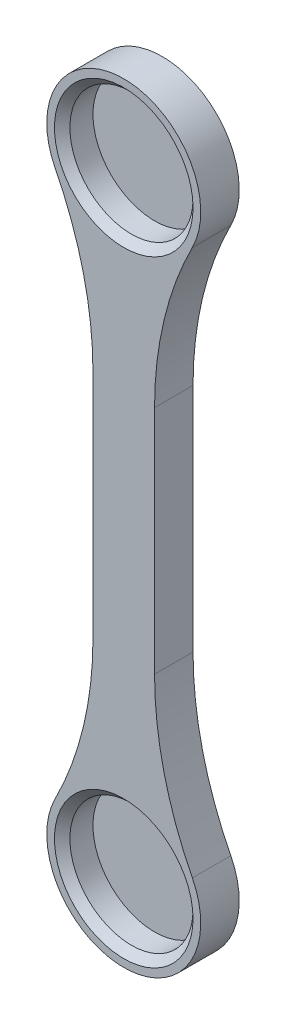
ISO-10303-21;
HEADER;
FILE_DESCRIPTION(('STEP AP214'),'2;1');
FILE_NAME('part.step','',(''),(''),'','','');
FILE_SCHEMA(('AUTOMOTIVE_DESIGN { 1 0 10303 214 1 1 1 1 }'));
ENDSEC;
DATA;
#1=APPLICATION_CONTEXT('core data for automotive mechanical design processes');
#2=APPLICATION_PROTOCOL_DEFINITION('international standard','automotive_design',2000,#1);
#3=PRODUCT_CONTEXT('',#1,'mechanical');
#4=PRODUCT('Part','Part','',(#3));
#5=PRODUCT_RELATED_PRODUCT_CATEGORY('part','',(#4));
#6=PRODUCT_DEFINITION_FORMATION('','',#4);
#7=PRODUCT_DEFINITION_CONTEXT('part definition',#1,'design');
#8=PRODUCT_DEFINITION('design','',#6,#7);
#9=PRODUCT_DEFINITION_SHAPE('','',#8);
#10=(LENGTH_UNIT() NAMED_UNIT(*) SI_UNIT(.MILLI.,.METRE.));
#11=(NAMED_UNIT(*) PLANE_ANGLE_UNIT() SI_UNIT($,.RADIAN.));
#12=(NAMED_UNIT(*) SI_UNIT($,.STERADIAN.) SOLID_ANGLE_UNIT());
#13=UNCERTAINTY_MEASURE_WITH_UNIT(LENGTH_MEASURE(1.E-05),#10,'distance_accuracy_value','');
#14=(GEOMETRIC_REPRESENTATION_CONTEXT(3) GLOBAL_UNCERTAINTY_ASSIGNED_CONTEXT((#13)) GLOBAL_UNIT_ASSIGNED_CONTEXT((#10,
#11,#12)) REPRESENTATION_CONTEXT('',''));
#15=CARTESIAN_POINT('',(0.,0.,0.));
#16=DIRECTION('',(0.,0.,1.));
#17=DIRECTION('',(1.,0.,0.));
#18=AXIS2_PLACEMENT_3D('',#15,#16,#17);
#19=CARTESIAN_POINT('',(0.,0.,5.));
#20=DIRECTION('',(0.,0.,-1.));
#21=DIRECTION('',(-1.,0.,0.));
#22=AXIS2_PLACEMENT_3D('',#19,#20,#21);
#23=CYLINDRICAL_SURFACE('',#22,10.);
#24=CARTESIAN_POINT('',(0.,0.,0.));
#25=DIRECTION('',(0.,0.,1.));
#26=DIRECTION('',(1.,0.,0.));
#27=AXIS2_PLACEMENT_3D('',#24,#25,#26);
#28=CIRCLE('',#27,10.);
#29=CARTESIAN_POINT('',(-8.91074130105901,4.53857791225414,0.));
#30=VERTEX_POINT('',#29);
#31=CARTESIAN_POINT('',(8.91074130105901,4.53857791225414,0.));
#32=VERTEX_POINT('',#31);
#33=EDGE_CURVE('E137',#30,#32,#28,.T.);
#34=ORIENTED_EDGE('',*,*,#33,.T.);
#35=DIRECTION('',(0.,0.,1.));
#36=VECTOR('',#35,1.);
#37=CARTESIAN_POINT('',(8.91074130105901,4.53857791225414,0.));
#38=LINE('',#37,#36);
#39=CARTESIAN_POINT('',(8.91074130105901,4.53857791225414,5.));
#40=VERTEX_POINT('',#39);
#41=EDGE_CURVE('E246',#32,#40,#38,.T.);
#42=ORIENTED_EDGE('',*,*,#41,.T.);
#43=CARTESIAN_POINT('',(0.,0.,5.));
#44=DIRECTION('',(0.,0.,1.));
#45=DIRECTION('',(1.,0.,0.));
#46=AXIS2_PLACEMENT_3D('',#43,#44,#45);
#47=CIRCLE('',#46,10.);
#48=CARTESIAN_POINT('',(-8.91074130105901,4.53857791225414,5.));
#49=VERTEX_POINT('',#48);
#50=EDGE_CURVE('E141',#49,#40,#47,.T.);
#51=ORIENTED_EDGE('',*,*,#50,.F.);
#52=DIRECTION('',(0.,0.,1.));
#53=VECTOR('',#52,1.);
#54=CARTESIAN_POINT('',(-8.91074130105901,4.53857791225414,0.));
#55=LINE('',#54,#53);
#56=EDGE_CURVE('E238',#30,#49,#55,.T.);
#57=ORIENTED_EDGE('',*,*,#56,.F.);
#58=EDGE_LOOP('',(#34,#42,#51,#57));
#59=FACE_BOUND('',#58,.T.);
#60=ADVANCED_FACE('F39',(#59),#23,.T.);
#61=CARTESIAN_POINT('',(0.,80.,5.));
#62=DIRECTION('',(0.,0.,-1.));
#63=DIRECTION('',(-1.,0.,0.));
#64=AXIS2_PLACEMENT_3D('',#61,#62,#63);
#65=CYLINDRICAL_SURFACE('',#64,10.);
#66=CARTESIAN_POINT('',(0.,80.,0.));
#67=DIRECTION('',(0.,0.,1.));
#68=DIRECTION('',(1.,0.,0.));
#69=AXIS2_PLACEMENT_3D('',#66,#67,#68);
#70=CIRCLE('',#69,10.);
#71=CARTESIAN_POINT('',(8.910741301059,75.4614220877458,0.));
#72=VERTEX_POINT('',#71);
#73=CARTESIAN_POINT('',(-8.910741301059,75.4614220877458,0.));
#74=VERTEX_POINT('',#73);
#75=EDGE_CURVE('E55',#72,#74,#70,.T.);
#76=ORIENTED_EDGE('',*,*,#75,.T.);
#77=DIRECTION('',(0.,0.,1.));
#78=VECTOR('',#77,1.);
#79=CARTESIAN_POINT('',(-8.910741301059,75.4614220877458,0.));
#80=LINE('',#79,#78);
#81=CARTESIAN_POINT('',(-8.910741301059,75.4614220877458,5.));
#82=VERTEX_POINT('',#81);
#83=EDGE_CURVE('E240',#74,#82,#80,.T.);
#84=ORIENTED_EDGE('',*,*,#83,.T.);
#85=CARTESIAN_POINT('',(0.,80.,5.));
#86=DIRECTION('',(0.,0.,1.));
#87=DIRECTION('',(1.,0.,0.));
#88=AXIS2_PLACEMENT_3D('',#85,#86,#87);
#89=CIRCLE('',#88,10.);
#90=CARTESIAN_POINT('',(8.910741301059,75.4614220877458,5.));
#91=VERTEX_POINT('',#90);
#92=EDGE_CURVE('E143',#91,#82,#89,.T.);
#93=ORIENTED_EDGE('',*,*,#92,.F.);
#94=DIRECTION('',(0.,0.,1.));
#95=VECTOR('',#94,1.);
#96=CARTESIAN_POINT('',(8.910741301059,75.4614220877458,0.));
#97=LINE('',#96,#95);
#98=EDGE_CURVE('E115',#72,#91,#97,.T.);
#99=ORIENTED_EDGE('',*,*,#98,.F.);
#100=EDGE_LOOP('',(#76,#84,#93,#99));
#101=FACE_BOUND('',#100,.T.);
#102=ADVANCED_FACE('F181',(#101),#65,.T.);
#103=CARTESIAN_POINT('',(0.,0.,5.));
#104=DIRECTION('',(0.,0.,1.));
#105=DIRECTION('',(1.,0.,0.));
#106=AXIS2_PLACEMENT_3D('',#103,#104,#105);
#107=PLANE('',#106);
#108=CARTESIAN_POINT('',(0.,0.,5.));
#109=DIRECTION('',(0.,0.,1.));
#110=DIRECTION('',(1.,0.,0.));
#111=AXIS2_PLACEMENT_3D('',#108,#109,#110);
#112=CIRCLE('',#111,9.00000000000002);
#113=CARTESIAN_POINT('',(9.00000000000002,0.,5.));
#114=VERTEX_POINT('',#113);
#115=EDGE_CURVE('E48',#114,#114,#112,.F.);
#116=ORIENTED_EDGE('',*,*,#115,.T.);
#117=EDGE_LOOP('',(#116));
#118=FACE_BOUND('',#117,.T.);
#119=CARTESIAN_POINT('',(0.,80.,5.));
#120=DIRECTION('',(0.,0.,1.));
#121=DIRECTION('',(1.,0.,0.));
#122=AXIS2_PLACEMENT_3D('',#119,#120,#121);
#123=CIRCLE('',#122,9.00000000000002);
#124=CARTESIAN_POINT('',(9.00000000000002,80.,5.));
#125=VERTEX_POINT('',#124);
#126=EDGE_CURVE('E150',#125,#125,#123,.F.);
#127=ORIENTED_EDGE('',*,*,#126,.T.);
#128=EDGE_LOOP('',(#127));
#129=FACE_BOUND('',#128,.T.);
#130=CARTESIAN_POINT('',(-49.0833333333333,25.,5.));
#131=DIRECTION('',(0.,0.,1.));
#132=DIRECTION('',(1.,0.,0.));
#133=AXIS2_PLACEMENT_3D('',#130,#131,#132);
#134=CIRCLE('',#133,45.0833333333333);
#135=CARTESIAN_POINT('',(-4.,25.,5.));
#136=VERTEX_POINT('',#135);
#137=EDGE_CURVE('E220',#49,#136,#134,.T.);
#138=ORIENTED_EDGE('',*,*,#137,.F.);
#139=ORIENTED_EDGE('',*,*,#50,.T.);
#140=CARTESIAN_POINT('',(49.0833333333333,25.,5.));
#141=DIRECTION('',(0.,0.,1.));
#142=DIRECTION('',(-1.,0.,0.));
#143=AXIS2_PLACEMENT_3D('',#140,#141,#142);
#144=CIRCLE('',#143,45.0833333333333);
#145=CARTESIAN_POINT('',(4.,25.,5.));
#146=VERTEX_POINT('',#145);
#147=EDGE_CURVE('E127',#146,#40,#144,.T.);
#148=ORIENTED_EDGE('',*,*,#147,.F.);
#149=DIRECTION('',(0.,-1.,0.));
#150=VECTOR('',#149,1.);
#151=CARTESIAN_POINT('',(4.,55.,5.));
#152=LINE('',#151,#150);
#153=CARTESIAN_POINT('',(4.,55.,5.));
#154=VERTEX_POINT('',#153);
#155=EDGE_CURVE('E130',#154,#146,#152,.T.);
#156=ORIENTED_EDGE('',*,*,#155,.F.);
#157=CARTESIAN_POINT('',(49.0833333333333,55.,5.));
#158=DIRECTION('',(0.,0.,1.));
#159=DIRECTION('',(1.,0.,0.));
#160=AXIS2_PLACEMENT_3D('',#157,#158,#159);
#161=CIRCLE('',#160,45.0833333333333);
#162=EDGE_CURVE('E111',#91,#154,#161,.T.);
#163=ORIENTED_EDGE('',*,*,#162,.F.);
#164=ORIENTED_EDGE('',*,*,#92,.T.);
#165=CARTESIAN_POINT('',(-49.0833333333333,55.,5.));
#166=DIRECTION('',(0.,0.,1.));
#167=DIRECTION('',(-1.,0.,0.));
#168=AXIS2_PLACEMENT_3D('',#165,#166,#167);
#169=CIRCLE('',#168,45.0833333333333);
#170=CARTESIAN_POINT('',(-4.,55.,5.));
#171=VERTEX_POINT('',#170);
#172=EDGE_CURVE('E227',#171,#82,#169,.T.);
#173=ORIENTED_EDGE('',*,*,#172,.F.);
#174=DIRECTION('',(0.,1.,0.));
#175=VECTOR('',#174,1.);
#176=CARTESIAN_POINT('',(-4.,55.,5.));
#177=LINE('',#176,#175);
#178=EDGE_CURVE('E224',#136,#171,#177,.T.);
#179=ORIENTED_EDGE('',*,*,#178,.F.);
#180=EDGE_LOOP('',(#138,#139,#148,#156,#163,#164,#173,#179));
#181=FACE_BOUND('',#180,.T.);
#182=ADVANCED_FACE('F155',(#118,#129,#181),#107,.T.);
#183=CARTESIAN_POINT('',(0.,0.,0.));
#184=DIRECTION('',(0.,0.,1.));
#185=DIRECTION('',(1.,0.,0.));
#186=AXIS2_PLACEMENT_3D('',#183,#184,#185);
#187=PLANE('',#186);
#188=ORIENTED_EDGE('',*,*,#33,.F.);
#189=CARTESIAN_POINT('',(-49.0833333333333,25.,0.));
#190=DIRECTION('',(0.,0.,1.));
#191=DIRECTION('',(1.,0.,0.));
#192=AXIS2_PLACEMENT_3D('',#189,#190,#191);
#193=CIRCLE('',#192,45.0833333333333);
#194=CARTESIAN_POINT('',(-4.,25.,0.));
#195=VERTEX_POINT('',#194);
#196=EDGE_CURVE('E253',#30,#195,#193,.T.);
#197=ORIENTED_EDGE('',*,*,#196,.T.);
#198=DIRECTION('',(0.,1.,0.));
#199=VECTOR('',#198,1.);
#200=CARTESIAN_POINT('',(-4.,55.,0.));
#201=LINE('',#200,#199);
#202=CARTESIAN_POINT('',(-4.,55.,0.));
#203=VERTEX_POINT('',#202);
#204=EDGE_CURVE('E243',#195,#203,#201,.T.);
#205=ORIENTED_EDGE('',*,*,#204,.T.);
#206=CARTESIAN_POINT('',(-49.0833333333333,55.,0.));
#207=DIRECTION('',(0.,0.,1.));
#208=DIRECTION('',(-1.,0.,0.));
#209=AXIS2_PLACEMENT_3D('',#206,#207,#208);
#210=CIRCLE('',#209,45.0833333333333);
#211=EDGE_CURVE('E229',#203,#74,#210,.T.);
#212=ORIENTED_EDGE('',*,*,#211,.T.);
#213=ORIENTED_EDGE('',*,*,#75,.F.);
#214=CARTESIAN_POINT('',(49.0833333333333,55.,0.));
#215=DIRECTION('',(0.,0.,1.));
#216=DIRECTION('',(1.,0.,0.));
#217=AXIS2_PLACEMENT_3D('',#214,#215,#216);
#218=CIRCLE('',#217,45.0833333333333);
#219=CARTESIAN_POINT('',(4.,55.,0.));
#220=VERTEX_POINT('',#219);
#221=EDGE_CURVE('E108',#72,#220,#218,.T.);
#222=ORIENTED_EDGE('',*,*,#221,.T.);
#223=DIRECTION('',(0.,-1.,0.));
#224=VECTOR('',#223,1.);
#225=CARTESIAN_POINT('',(4.,55.,0.));
#226=LINE('',#225,#224);
#227=CARTESIAN_POINT('',(4.,25.,0.));
#228=VERTEX_POINT('',#227);
#229=EDGE_CURVE('E119',#220,#228,#226,.T.);
#230=ORIENTED_EDGE('',*,*,#229,.T.);
#231=CARTESIAN_POINT('',(49.0833333333333,25.,0.));
#232=DIRECTION('',(0.,0.,1.));
#233=DIRECTION('',(-1.,0.,0.));
#234=AXIS2_PLACEMENT_3D('',#231,#232,#233);
#235=CIRCLE('',#234,45.0833333333333);
#236=EDGE_CURVE('E123',#228,#32,#235,.T.);
#237=ORIENTED_EDGE('',*,*,#236,.T.);
#238=EDGE_LOOP('',(#188,#197,#205,#212,#213,#222,#230,#237));
#239=FACE_BOUND('',#238,.T.);
#240=ADVANCED_FACE('F126',(#239),#187,.F.);
#241=CARTESIAN_POINT('',(0.,80.,1.));
#242=DIRECTION('',(0.,0.,1.));
#243=DIRECTION('',(1.,0.,0.));
#244=AXIS2_PLACEMENT_3D('',#241,#242,#243);
#245=CYLINDRICAL_SURFACE('',#244,8.);
#246=CARTESIAN_POINT('',(0.,80.,3.99999999999998));
#247=DIRECTION('',(0.,0.,1.));
#248=DIRECTION('',(1.,0.,0.));
#249=AXIS2_PLACEMENT_3D('',#246,#247,#248);
#250=CIRCLE('',#249,8.);
#251=CARTESIAN_POINT('',(8.,80.,3.99999999999998));
#252=VERTEX_POINT('',#251);
#253=EDGE_CURVE('E11',#252,#252,#250,.T.);
#254=ORIENTED_EDGE('',*,*,#253,.T.);
#255=EDGE_LOOP('',(#254));
#256=FACE_BOUND('',#255,.T.);
#257=CARTESIAN_POINT('',(0.,80.,1.));
#258=DIRECTION('',(0.,0.,1.));
#259=DIRECTION('',(1.,0.,0.));
#260=AXIS2_PLACEMENT_3D('',#257,#258,#259);
#261=CIRCLE('',#260,8.);
#262=CARTESIAN_POINT('',(8.,80.,1.));
#263=VERTEX_POINT('',#262);
#264=EDGE_CURVE('E138',#263,#263,#261,.T.);
#265=ORIENTED_EDGE('',*,*,#264,.F.);
#266=EDGE_LOOP('',(#265));
#267=FACE_BOUND('',#266,.T.);
#268=ADVANCED_FACE('F197',(#256,#267),#245,.F.);
#269=CARTESIAN_POINT('',(0.,80.,1.));
#270=DIRECTION('',(0.,0.,1.));
#271=DIRECTION('',(1.,0.,0.));
#272=AXIS2_PLACEMENT_3D('',#269,#270,#271);
#273=PLANE('',#272);
#274=ORIENTED_EDGE('',*,*,#264,.T.);
#275=EDGE_LOOP('',(#274));
#276=FACE_BOUND('',#275,.T.);
#277=ADVANCED_FACE('F168',(#276),#273,.T.);
#278=CARTESIAN_POINT('',(0.,0.,1.));
#279=DIRECTION('',(0.,0.,1.));
#280=DIRECTION('',(1.,0.,0.));
#281=AXIS2_PLACEMENT_3D('',#278,#279,#280);
#282=CYLINDRICAL_SURFACE('',#281,8.);
#283=CARTESIAN_POINT('',(0.,0.,3.99999999999998));
#284=DIRECTION('',(0.,0.,1.));
#285=DIRECTION('',(1.,0.,0.));
#286=AXIS2_PLACEMENT_3D('',#283,#284,#285);
#287=CIRCLE('',#286,8.);
#288=CARTESIAN_POINT('',(8.,0.,3.99999999999998));
#289=VERTEX_POINT('',#288);
#290=EDGE_CURVE('E145',#289,#289,#287,.T.);
#291=ORIENTED_EDGE('',*,*,#290,.T.);
#292=EDGE_LOOP('',(#291));
#293=FACE_BOUND('',#292,.T.);
#294=CARTESIAN_POINT('',(0.,0.,1.));
#295=DIRECTION('',(0.,0.,1.));
#296=DIRECTION('',(1.,0.,0.));
#297=AXIS2_PLACEMENT_3D('',#294,#295,#296);
#298=CIRCLE('',#297,8.);
#299=CARTESIAN_POINT('',(8.,0.,1.));
#300=VERTEX_POINT('',#299);
#301=EDGE_CURVE('E134',#300,#300,#298,.T.);
#302=ORIENTED_EDGE('',*,*,#301,.F.);
#303=EDGE_LOOP('',(#302));
#304=FACE_BOUND('',#303,.T.);
#305=ADVANCED_FACE('F164',(#293,#304),#282,.F.);
#306=CARTESIAN_POINT('',(0.,0.,1.));
#307=DIRECTION('',(0.,0.,1.));
#308=DIRECTION('',(1.,0.,0.));
#309=AXIS2_PLACEMENT_3D('',#306,#307,#308);
#310=PLANE('',#309);
#311=ORIENTED_EDGE('',*,*,#301,.T.);
#312=EDGE_LOOP('',(#311));
#313=FACE_BOUND('',#312,.T.);
#314=ADVANCED_FACE('F167',(#313),#310,.T.);
#315=CARTESIAN_POINT('',(49.0833333333333,25.,0.));
#316=DIRECTION('',(0.,0.,1.));
#317=DIRECTION('',(1.,0.,0.));
#318=AXIS2_PLACEMENT_3D('',#315,#316,#317);
#319=CYLINDRICAL_SURFACE('',#318,45.0833333333333);
#320=ORIENTED_EDGE('',*,*,#147,.T.);
#321=ORIENTED_EDGE('',*,*,#41,.F.);
#322=ORIENTED_EDGE('',*,*,#236,.F.);
#323=DIRECTION('',(0.,0.,1.));
#324=VECTOR('',#323,1.);
#325=CARTESIAN_POINT('',(4.,25.,0.));
#326=LINE('',#325,#324);
#327=EDGE_CURVE('E116',#228,#146,#326,.T.);
#328=ORIENTED_EDGE('',*,*,#327,.T.);
#329=EDGE_LOOP('',(#320,#321,#322,#328));
#330=FACE_BOUND('',#329,.T.);
#331=ADVANCED_FACE('F173',(#330),#319,.F.);
#332=CARTESIAN_POINT('',(4.,55.,0.));
#333=DIRECTION('',(-1.,0.,0.));
#334=DIRECTION('',(0.,0.,1.));
#335=AXIS2_PLACEMENT_3D('',#332,#333,#334);
#336=PLANE('',#335);
#337=ORIENTED_EDGE('',*,*,#155,.T.);
#338=ORIENTED_EDGE('',*,*,#327,.F.);
#339=ORIENTED_EDGE('',*,*,#229,.F.);
#340=DIRECTION('',(0.,0.,1.));
#341=VECTOR('',#340,1.);
#342=CARTESIAN_POINT('',(4.,55.,0.));
#343=LINE('',#342,#341);
#344=EDGE_CURVE('E104',#220,#154,#343,.T.);
#345=ORIENTED_EDGE('',*,*,#344,.T.);
#346=EDGE_LOOP('',(#337,#338,#339,#345));
#347=FACE_BOUND('',#346,.T.);
#348=ADVANCED_FACE('F120',(#347),#336,.F.);
#349=CARTESIAN_POINT('',(49.0833333333333,55.,0.));
#350=DIRECTION('',(0.,0.,1.));
#351=DIRECTION('',(1.,0.,0.));
#352=AXIS2_PLACEMENT_3D('',#349,#350,#351);
#353=CYLINDRICAL_SURFACE('',#352,45.0833333333333);
#354=ORIENTED_EDGE('',*,*,#162,.T.);
#355=ORIENTED_EDGE('',*,*,#344,.F.);
#356=ORIENTED_EDGE('',*,*,#221,.F.);
#357=ORIENTED_EDGE('',*,*,#98,.T.);
#358=EDGE_LOOP('',(#354,#355,#356,#357));
#359=FACE_BOUND('',#358,.T.);
#360=ADVANCED_FACE('F106',(#359),#353,.F.);
#361=CARTESIAN_POINT('',(-49.0833333333333,55.,0.));
#362=DIRECTION('',(0.,0.,1.));
#363=DIRECTION('',(1.,0.,0.));
#364=AXIS2_PLACEMENT_3D('',#361,#362,#363);
#365=CYLINDRICAL_SURFACE('',#364,45.0833333333333);
#366=ORIENTED_EDGE('',*,*,#172,.T.);
#367=ORIENTED_EDGE('',*,*,#83,.F.);
#368=ORIENTED_EDGE('',*,*,#211,.F.);
#369=DIRECTION('',(0.,0.,1.));
#370=VECTOR('',#369,1.);
#371=CARTESIAN_POINT('',(-4.,55.,0.));
#372=LINE('',#371,#370);
#373=EDGE_CURVE('E64',#203,#171,#372,.T.);
#374=ORIENTED_EDGE('',*,*,#373,.T.);
#375=EDGE_LOOP('',(#366,#367,#368,#374));
#376=FACE_BOUND('',#375,.T.);
#377=ADVANCED_FACE('F260',(#376),#365,.F.);
#378=CARTESIAN_POINT('',(-4.,55.,0.));
#379=DIRECTION('',(1.,0.,0.));
#380=DIRECTION('',(0.,0.,-1.));
#381=AXIS2_PLACEMENT_3D('',#378,#379,#380);
#382=PLANE('',#381);
#383=ORIENTED_EDGE('',*,*,#178,.T.);
#384=ORIENTED_EDGE('',*,*,#373,.F.);
#385=ORIENTED_EDGE('',*,*,#204,.F.);
#386=DIRECTION('',(0.,0.,1.));
#387=VECTOR('',#386,1.);
#388=CARTESIAN_POINT('',(-4.,25.,0.));
#389=LINE('',#388,#387);
#390=EDGE_CURVE('E236',#195,#136,#389,.T.);
#391=ORIENTED_EDGE('',*,*,#390,.T.);
#392=EDGE_LOOP('',(#383,#384,#385,#391));
#393=FACE_BOUND('',#392,.T.);
#394=ADVANCED_FACE('F261',(#393),#382,.F.);
#395=CARTESIAN_POINT('',(-49.0833333333333,25.,0.));
#396=DIRECTION('',(0.,0.,1.));
#397=DIRECTION('',(1.,0.,0.));
#398=AXIS2_PLACEMENT_3D('',#395,#396,#397);
#399=CYLINDRICAL_SURFACE('',#398,45.0833333333333);
#400=ORIENTED_EDGE('',*,*,#137,.T.);
#401=ORIENTED_EDGE('',*,*,#390,.F.);
#402=ORIENTED_EDGE('',*,*,#196,.F.);
#403=ORIENTED_EDGE('',*,*,#56,.T.);
#404=EDGE_LOOP('',(#400,#401,#402,#403));
#405=FACE_BOUND('',#404,.T.);
#406=ADVANCED_FACE('F161',(#405),#399,.F.);
#407=CARTESIAN_POINT('',(0.,0.,3.99999999999998));
#408=DIRECTION('',(0.,0.,1.));
#409=DIRECTION('',(1.,0.,0.));
#410=AXIS2_PLACEMENT_3D('',#407,#408,#409);
#411=CONICAL_SURFACE('',#410,8.,0.785398163397448);
#412=ORIENTED_EDGE('',*,*,#115,.F.);
#413=EDGE_LOOP('',(#412));
#414=FACE_BOUND('',#413,.T.);
#415=ORIENTED_EDGE('',*,*,#290,.F.);
#416=EDGE_LOOP('',(#415));
#417=FACE_BOUND('',#416,.T.);
#418=ADVANCED_FACE('F158',(#414,#417),#411,.F.);
#419=CARTESIAN_POINT('',(0.,80.,3.99999999999998));
#420=DIRECTION('',(0.,0.,1.));
#421=DIRECTION('',(1.,0.,0.));
#422=AXIS2_PLACEMENT_3D('',#419,#420,#421);
#423=CONICAL_SURFACE('',#422,8.,0.785398163397448);
#424=ORIENTED_EDGE('',*,*,#126,.F.);
#425=EDGE_LOOP('',(#424));
#426=FACE_BOUND('',#425,.T.);
#427=ORIENTED_EDGE('',*,*,#253,.F.);
#428=EDGE_LOOP('',(#427));
#429=FACE_BOUND('',#428,.T.);
#430=ADVANCED_FACE('F42',(#426,#429),#423,.F.);
#431=CLOSED_SHELL('',(#60,#102,#182,#240,#268,#277,#305,#314,#331,#348,#360,#377,#394,#406,#418,#430));
#432=MANIFOLD_SOLID_BREP('B2',#431);
#433=ADVANCED_BREP_SHAPE_REPRESENTATION('',(#18,#432),#14);
#434=SHAPE_DEFINITION_REPRESENTATION(#9,#433);
ENDSEC;
END-ISO-10303-21;
